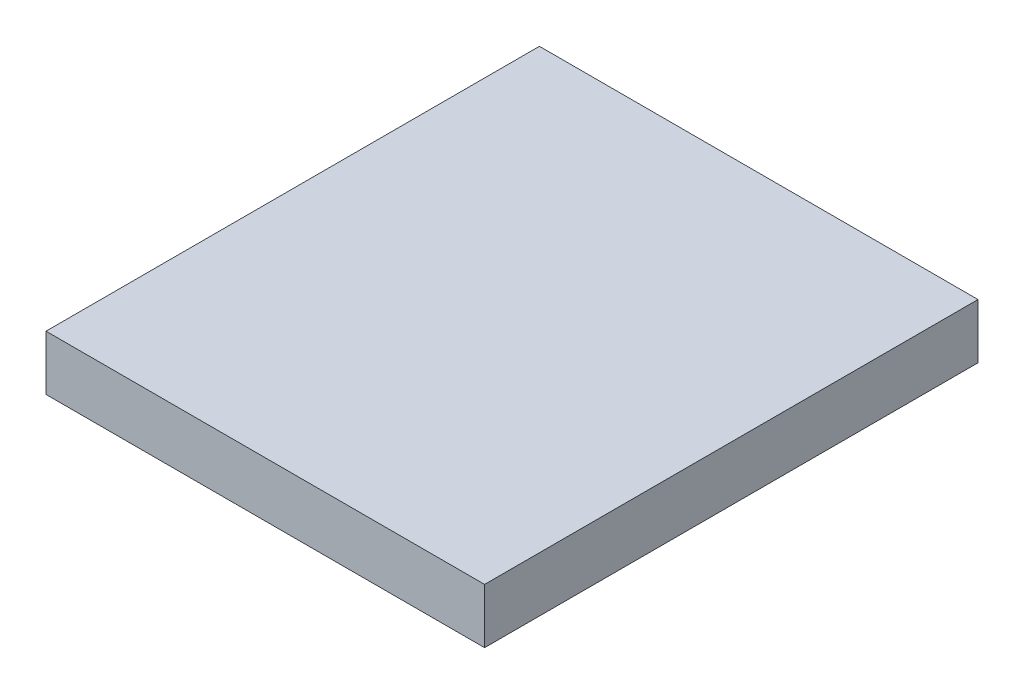
ISO-10303-21;
HEADER;
FILE_DESCRIPTION(('STEP AP214'),'2;1');
FILE_NAME('part.step','',(''),(''),'','','');
FILE_SCHEMA(('AUTOMOTIVE_DESIGN { 1 0 10303 214 1 1 1 1 }'));
ENDSEC;
DATA;
#1=APPLICATION_CONTEXT('core data for automotive mechanical design processes');
#2=APPLICATION_PROTOCOL_DEFINITION('international standard','automotive_design',2000,#1);
#3=PRODUCT_CONTEXT('',#1,'mechanical');
#4=PRODUCT('Part','Part','',(#3));
#5=PRODUCT_RELATED_PRODUCT_CATEGORY('part','',(#4));
#6=PRODUCT_DEFINITION_FORMATION('','',#4);
#7=PRODUCT_DEFINITION_CONTEXT('part definition',#1,'design');
#8=PRODUCT_DEFINITION('design','',#6,#7);
#9=PRODUCT_DEFINITION_SHAPE('','',#8);
#10=(LENGTH_UNIT() NAMED_UNIT(*) SI_UNIT(.MILLI.,.METRE.));
#11=(NAMED_UNIT(*) PLANE_ANGLE_UNIT() SI_UNIT($,.RADIAN.));
#12=(NAMED_UNIT(*) SI_UNIT($,.STERADIAN.) SOLID_ANGLE_UNIT());
#13=UNCERTAINTY_MEASURE_WITH_UNIT(LENGTH_MEASURE(1.E-05),#10,'distance_accuracy_value','');
#14=(GEOMETRIC_REPRESENTATION_CONTEXT(3) GLOBAL_UNCERTAINTY_ASSIGNED_CONTEXT((#13)) GLOBAL_UNIT_ASSIGNED_CONTEXT((#10,
#11,#12)) REPRESENTATION_CONTEXT('',''));
#15=CARTESIAN_POINT('',(0.,0.,0.));
#16=DIRECTION('',(0.,0.,1.));
#17=DIRECTION('',(1.,0.,0.));
#18=AXIS2_PLACEMENT_3D('',#15,#16,#17);
#19=CARTESIAN_POINT('',(101.6,25.4,114.3));
#20=DIRECTION('',(-1.,0.,0.));
#21=DIRECTION('',(0.,0.,1.));
#22=AXIS2_PLACEMENT_3D('',#19,#20,#21);
#23=PLANE('',#22);
#24=DIRECTION('',(0.,0.,-1.));
#25=VECTOR('',#24,1.);
#26=CARTESIAN_POINT('',(101.6,0.,114.3));
#27=LINE('',#26,#25);
#28=CARTESIAN_POINT('',(101.6,0.,114.3));
#29=VERTEX_POINT('',#28);
#30=CARTESIAN_POINT('',(101.6,0.,-114.3));
#31=VERTEX_POINT('',#30);
#32=EDGE_CURVE('E100',#29,#31,#27,.T.);
#33=ORIENTED_EDGE('',*,*,#32,.T.);
#34=DIRECTION('',(0.,-1.,0.));
#35=VECTOR('',#34,1.);
#36=CARTESIAN_POINT('',(101.6,25.4,-114.3));
#37=LINE('',#36,#35);
#38=CARTESIAN_POINT('',(101.6,25.4,-114.3));
#39=VERTEX_POINT('',#38);
#40=EDGE_CURVE('E11',#39,#31,#37,.T.);
#41=ORIENTED_EDGE('',*,*,#40,.F.);
#42=DIRECTION('',(0.,0.,-1.));
#43=VECTOR('',#42,1.);
#44=CARTESIAN_POINT('',(101.6,25.4,114.3));
#45=LINE('',#44,#43);
#46=CARTESIAN_POINT('',(101.6,25.4,114.3));
#47=VERTEX_POINT('',#46);
#48=EDGE_CURVE('E88',#47,#39,#45,.T.);
#49=ORIENTED_EDGE('',*,*,#48,.F.);
#50=DIRECTION('',(0.,-1.,0.));
#51=VECTOR('',#50,1.);
#52=CARTESIAN_POINT('',(101.6,25.4,114.3));
#53=LINE('',#52,#51);
#54=EDGE_CURVE('E96',#47,#29,#53,.T.);
#55=ORIENTED_EDGE('',*,*,#54,.T.);
#56=EDGE_LOOP('',(#33,#41,#49,#55));
#57=FACE_BOUND('',#56,.T.);
#58=ADVANCED_FACE('F37',(#57),#23,.F.);
#59=CARTESIAN_POINT('',(-101.6,25.4,-114.3));
#60=DIRECTION('',(0.,0.,1.));
#61=DIRECTION('',(1.,0.,0.));
#62=AXIS2_PLACEMENT_3D('',#59,#60,#61);
#63=PLANE('',#62);
#64=DIRECTION('',(-1.,0.,0.));
#65=VECTOR('',#64,1.);
#66=CARTESIAN_POINT('',(-101.6,0.,-114.3));
#67=LINE('',#66,#65);
#68=CARTESIAN_POINT('',(-101.6,0.,-114.3));
#69=VERTEX_POINT('',#68);
#70=EDGE_CURVE('E92',#31,#69,#67,.T.);
#71=ORIENTED_EDGE('',*,*,#70,.T.);
#72=DIRECTION('',(0.,-1.,0.));
#73=VECTOR('',#72,1.);
#74=CARTESIAN_POINT('',(-101.6,25.4,-114.3));
#75=LINE('',#74,#73);
#76=CARTESIAN_POINT('',(-101.6,25.4,-114.3));
#77=VERTEX_POINT('',#76);
#78=EDGE_CURVE('E45',#77,#69,#75,.T.);
#79=ORIENTED_EDGE('',*,*,#78,.F.);
#80=DIRECTION('',(-1.,0.,0.));
#81=VECTOR('',#80,1.);
#82=CARTESIAN_POINT('',(-101.6,25.4,-114.3));
#83=LINE('',#82,#81);
#84=EDGE_CURVE('E83',#39,#77,#83,.T.);
#85=ORIENTED_EDGE('',*,*,#84,.F.);
#86=ORIENTED_EDGE('',*,*,#40,.T.);
#87=EDGE_LOOP('',(#71,#79,#85,#86));
#88=FACE_BOUND('',#87,.T.);
#89=ADVANCED_FACE('F91',(#88),#63,.F.);
#90=CARTESIAN_POINT('',(-101.6,25.4,114.3));
#91=DIRECTION('',(1.,0.,0.));
#92=DIRECTION('',(0.,0.,-1.));
#93=AXIS2_PLACEMENT_3D('',#90,#91,#92);
#94=PLANE('',#93);
#95=DIRECTION('',(0.,0.,1.));
#96=VECTOR('',#95,1.);
#97=CARTESIAN_POINT('',(-101.6,0.,114.3));
#98=LINE('',#97,#96);
#99=CARTESIAN_POINT('',(-101.6,0.,114.3));
#100=VERTEX_POINT('',#99);
#101=EDGE_CURVE('E70',#69,#100,#98,.T.);
#102=ORIENTED_EDGE('',*,*,#101,.T.);
#103=DIRECTION('',(0.,-1.,0.));
#104=VECTOR('',#103,1.);
#105=CARTESIAN_POINT('',(-101.6,25.4,114.3));
#106=LINE('',#105,#104);
#107=CARTESIAN_POINT('',(-101.6,25.4,114.3));
#108=VERTEX_POINT('',#107);
#109=EDGE_CURVE('E93',#108,#100,#106,.T.);
#110=ORIENTED_EDGE('',*,*,#109,.F.);
#111=DIRECTION('',(0.,0.,1.));
#112=VECTOR('',#111,1.);
#113=CARTESIAN_POINT('',(-101.6,25.4,114.3));
#114=LINE('',#113,#112);
#115=EDGE_CURVE('E86',#77,#108,#114,.T.);
#116=ORIENTED_EDGE('',*,*,#115,.F.);
#117=ORIENTED_EDGE('',*,*,#78,.T.);
#118=EDGE_LOOP('',(#102,#110,#116,#117));
#119=FACE_BOUND('',#118,.T.);
#120=ADVANCED_FACE('F94',(#119),#94,.F.);
#121=CARTESIAN_POINT('',(-101.6,25.4,114.3));
#122=DIRECTION('',(0.,0.,-1.));
#123=DIRECTION('',(-1.,0.,0.));
#124=AXIS2_PLACEMENT_3D('',#121,#122,#123);
#125=PLANE('',#124);
#126=DIRECTION('',(1.,0.,0.));
#127=VECTOR('',#126,1.);
#128=CARTESIAN_POINT('',(-101.6,0.,114.3));
#129=LINE('',#128,#127);
#130=EDGE_CURVE('E76',#100,#29,#129,.T.);
#131=ORIENTED_EDGE('',*,*,#130,.T.);
#132=ORIENTED_EDGE('',*,*,#54,.F.);
#133=DIRECTION('',(1.,0.,0.));
#134=VECTOR('',#133,1.);
#135=CARTESIAN_POINT('',(-101.6,25.4,114.3));
#136=LINE('',#135,#134);
#137=EDGE_CURVE('E53',#108,#47,#136,.T.);
#138=ORIENTED_EDGE('',*,*,#137,.F.);
#139=ORIENTED_EDGE('',*,*,#109,.T.);
#140=EDGE_LOOP('',(#131,#132,#138,#139));
#141=FACE_BOUND('',#140,.T.);
#142=ADVANCED_FACE('F107',(#141),#125,.F.);
#143=CARTESIAN_POINT('',(0.,25.4,0.));
#144=DIRECTION('',(0.,-1.,0.));
#145=DIRECTION('',(0.,0.,-1.));
#146=AXIS2_PLACEMENT_3D('',#143,#144,#145);
#147=PLANE('',#146);
#148=ORIENTED_EDGE('',*,*,#48,.T.);
#149=ORIENTED_EDGE('',*,*,#84,.T.);
#150=ORIENTED_EDGE('',*,*,#115,.T.);
#151=ORIENTED_EDGE('',*,*,#137,.T.);
#152=EDGE_LOOP('',(#148,#149,#150,#151));
#153=FACE_BOUND('',#152,.T.);
#154=ADVANCED_FACE('F84',(#153),#147,.F.);
#155=CARTESIAN_POINT('',(0.,0.,0.));
#156=DIRECTION('',(0.,-1.,0.));
#157=DIRECTION('',(0.,0.,-1.));
#158=AXIS2_PLACEMENT_3D('',#155,#156,#157);
#159=PLANE('',#158);
#160=ORIENTED_EDGE('',*,*,#32,.F.);
#161=ORIENTED_EDGE('',*,*,#130,.F.);
#162=ORIENTED_EDGE('',*,*,#101,.F.);
#163=ORIENTED_EDGE('',*,*,#70,.F.);
#164=EDGE_LOOP('',(#160,#161,#162,#163));
#165=FACE_BOUND('',#164,.T.);
#166=ADVANCED_FACE('F110',(#165),#159,.T.);
#167=CLOSED_SHELL('',(#58,#89,#120,#142,#154,#166));
#168=MANIFOLD_SOLID_BREP('B2',#167);
#169=ADVANCED_BREP_SHAPE_REPRESENTATION('',(#18,#168),#14);
#170=SHAPE_DEFINITION_REPRESENTATION(#9,#169);
ENDSEC;
END-ISO-10303-21;
